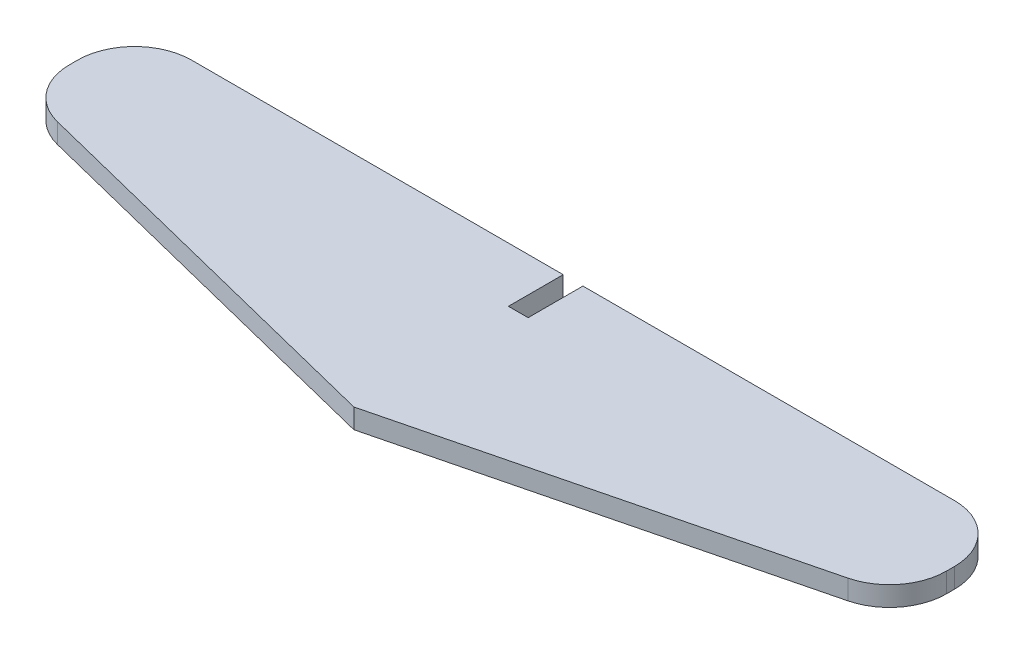
ISO-10303-21;
HEADER;
FILE_DESCRIPTION(('STEP AP214'),'2;1');
FILE_NAME('part.step','',(''),(''),'','','');
FILE_SCHEMA(('AUTOMOTIVE_DESIGN { 1 0 10303 214 1 1 1 1 }'));
ENDSEC;
DATA;
#1=APPLICATION_CONTEXT('core data for automotive mechanical design processes');
#2=APPLICATION_PROTOCOL_DEFINITION('international standard','automotive_design',2000,#1);
#3=PRODUCT_CONTEXT('',#1,'mechanical');
#4=PRODUCT('Part','Part','',(#3));
#5=PRODUCT_RELATED_PRODUCT_CATEGORY('part','',(#4));
#6=PRODUCT_DEFINITION_FORMATION('','',#4);
#7=PRODUCT_DEFINITION_CONTEXT('part definition',#1,'design');
#8=PRODUCT_DEFINITION('design','',#6,#7);
#9=PRODUCT_DEFINITION_SHAPE('','',#8);
#10=(LENGTH_UNIT() NAMED_UNIT(*) SI_UNIT(.MILLI.,.METRE.));
#11=(NAMED_UNIT(*) PLANE_ANGLE_UNIT() SI_UNIT($,.RADIAN.));
#12=(NAMED_UNIT(*) SI_UNIT($,.STERADIAN.) SOLID_ANGLE_UNIT());
#13=UNCERTAINTY_MEASURE_WITH_UNIT(LENGTH_MEASURE(1.E-05),#10,'distance_accuracy_value','');
#14=(GEOMETRIC_REPRESENTATION_CONTEXT(3) GLOBAL_UNCERTAINTY_ASSIGNED_CONTEXT((#13)) GLOBAL_UNIT_ASSIGNED_CONTEXT((#10,
#11,#12)) REPRESENTATION_CONTEXT('',''));
#15=CARTESIAN_POINT('',(0.,0.,0.));
#16=DIRECTION('',(0.,0.,1.));
#17=DIRECTION('',(1.,0.,0.));
#18=AXIS2_PLACEMENT_3D('',#15,#16,#17);
#19=CARTESIAN_POINT('',(7.9698067837182,4.5,-50.));
#20=DIRECTION('',(0.,0.,1.));
#21=DIRECTION('',(1.,0.,0.));
#22=AXIS2_PLACEMENT_3D('',#19,#20,#21);
#23=PLANE('',#22);
#24=DIRECTION('',(-1.,0.,0.));
#25=VECTOR('',#24,1.);
#26=CARTESIAN_POINT('',(7.9698067837182,0.,-50.));
#27=LINE('',#26,#25);
#28=CARTESIAN_POINT('',(7.9698067837182,0.,-50.));
#29=VERTEX_POINT('',#28);
#30=CARTESIAN_POINT('',(-76.7801932162818,0.,-50.));
#31=VERTEX_POINT('',#30);
#32=EDGE_CURVE('E170',#29,#31,#27,.T.);
#33=ORIENTED_EDGE('',*,*,#32,.T.);
#34=DIRECTION('',(0.,-1.,0.));
#35=VECTOR('',#34,1.);
#36=CARTESIAN_POINT('',(-76.7801932162818,4.5,-50.));
#37=LINE('',#36,#35);
#38=CARTESIAN_POINT('',(-76.7801932162818,4.5,-50.));
#39=VERTEX_POINT('',#38);
#40=EDGE_CURVE('E220',#31,#39,#37,.F.);
#41=ORIENTED_EDGE('',*,*,#40,.T.);
#42=DIRECTION('',(-1.,0.,0.));
#43=VECTOR('',#42,1.);
#44=CARTESIAN_POINT('',(7.9698067837182,4.5,-50.));
#45=LINE('',#44,#43);
#46=CARTESIAN_POINT('',(7.9698067837182,4.5,-50.));
#47=VERTEX_POINT('',#46);
#48=EDGE_CURVE('E189',#47,#39,#45,.T.);
#49=ORIENTED_EDGE('',*,*,#48,.F.);
#50=DIRECTION('',(0.,-1.,0.));
#51=VECTOR('',#50,1.);
#52=CARTESIAN_POINT('',(7.9698067837182,4.5,-50.));
#53=LINE('',#52,#51);
#54=EDGE_CURVE('E169',#47,#29,#53,.T.);
#55=ORIENTED_EDGE('',*,*,#54,.T.);
#56=EDGE_LOOP('',(#33,#41,#49,#55));
#57=FACE_BOUND('',#56,.T.);
#58=ADVANCED_FACE('F35',(#57),#23,.F.);
#59=CARTESIAN_POINT('',(-89.7801932162818,4.5,-50.));
#60=DIRECTION('',(1.,0.,0.));
#61=DIRECTION('',(0.,0.,-1.));
#62=AXIS2_PLACEMENT_3D('',#59,#60,#61);
#63=PLANE('',#62);
#64=DIRECTION('',(0.,0.,1.));
#65=VECTOR('',#64,1.);
#66=CARTESIAN_POINT('',(-89.7801932162818,0.,-50.));
#67=LINE('',#66,#65);
#68=CARTESIAN_POINT('',(-89.7801932162818,0.,-37.));
#69=VERTEX_POINT('',#68);
#70=CARTESIAN_POINT('',(-89.7801932162818,0.,-35.1500932832574));
#71=VERTEX_POINT('',#70);
#72=EDGE_CURVE('E173',#69,#71,#67,.T.);
#73=ORIENTED_EDGE('',*,*,#72,.T.);
#74=DIRECTION('',(0.,-1.,0.));
#75=VECTOR('',#74,1.);
#76=CARTESIAN_POINT('',(-89.7801932162818,4.5,-35.1500932832574));
#77=LINE('',#76,#75);
#78=CARTESIAN_POINT('',(-89.7801932162818,4.5,-35.1500932832574));
#79=VERTEX_POINT('',#78);
#80=EDGE_CURVE('E212',#71,#79,#77,.F.);
#81=ORIENTED_EDGE('',*,*,#80,.T.);
#82=DIRECTION('',(0.,0.,1.));
#83=VECTOR('',#82,1.);
#84=CARTESIAN_POINT('',(-89.7801932162818,4.5,-50.));
#85=LINE('',#84,#83);
#86=CARTESIAN_POINT('',(-89.7801932162818,4.5,-37.));
#87=VERTEX_POINT('',#86);
#88=EDGE_CURVE('E141',#87,#79,#85,.T.);
#89=ORIENTED_EDGE('',*,*,#88,.F.);
#90=DIRECTION('',(0.,-1.,0.));
#91=VECTOR('',#90,1.);
#92=CARTESIAN_POINT('',(-89.7801932162818,4.5,-37.));
#93=LINE('',#92,#91);
#94=EDGE_CURVE('E209',#87,#69,#93,.T.);
#95=ORIENTED_EDGE('',*,*,#94,.T.);
#96=EDGE_LOOP('',(#73,#81,#89,#95));
#97=FACE_BOUND('',#96,.T.);
#98=ADVANCED_FACE('F267',(#97),#63,.F.);
#99=CARTESIAN_POINT('',(10.2198067837182,4.5,0.));
#100=DIRECTION('',(0.242535625036333,0.,-0.970142500145332));
#101=DIRECTION('',(-0.970142500145332,0.,-0.242535625036333));
#102=AXIS2_PLACEMENT_3D('',#99,#100,#101);
#103=PLANE('',#102);
#104=DIRECTION('',(0.970142500145332,0.,0.242535625036333));
#105=VECTOR('',#104,1.);
#106=CARTESIAN_POINT('',(10.2198067837182,4.5,0.));
#107=LINE('',#106,#105);
#108=CARTESIAN_POINT('',(-79.9331563417541,4.5,-22.5382407813681));
#109=VERTEX_POINT('',#108);
#110=CARTESIAN_POINT('',(10.2198067837182,4.5,0.));
#111=VERTEX_POINT('',#110);
#112=EDGE_CURVE('E129',#109,#111,#107,.T.);
#113=ORIENTED_EDGE('',*,*,#112,.F.);
#114=DIRECTION('',(0.,-1.,0.));
#115=VECTOR('',#114,1.);
#116=CARTESIAN_POINT('',(-79.9331563417541,4.5,-22.5382407813681));
#117=LINE('',#116,#115);
#118=CARTESIAN_POINT('',(-79.9331563417541,0.,-22.5382407813681));
#119=VERTEX_POINT('',#118);
#120=EDGE_CURVE('E151',#109,#119,#117,.T.);
#121=ORIENTED_EDGE('',*,*,#120,.T.);
#122=DIRECTION('',(0.970142500145332,0.,0.242535625036333));
#123=VECTOR('',#122,1.);
#124=CARTESIAN_POINT('',(10.2198067837182,0.,0.));
#125=LINE('',#124,#123);
#126=CARTESIAN_POINT('',(10.2198067837182,0.,0.));
#127=VERTEX_POINT('',#126);
#128=EDGE_CURVE('E147',#119,#127,#125,.T.);
#129=ORIENTED_EDGE('',*,*,#128,.T.);
#130=DIRECTION('',(0.,-1.,0.));
#131=VECTOR('',#130,1.);
#132=CARTESIAN_POINT('',(10.2198067837182,4.5,0.));
#133=LINE('',#132,#131);
#134=EDGE_CURVE('E144',#111,#127,#133,.T.);
#135=ORIENTED_EDGE('',*,*,#134,.F.);
#136=EDGE_LOOP('',(#113,#121,#129,#135));
#137=FACE_BOUND('',#136,.T.);
#138=ADVANCED_FACE('F145',(#137),#103,.F.);
#139=CARTESIAN_POINT('',(10.2198067837182,4.5,0.));
#140=DIRECTION('',(-0.242535625036333,0.,-0.970142500145332));
#141=DIRECTION('',(-0.970142500145332,0.,0.242535625036333));
#142=AXIS2_PLACEMENT_3D('',#139,#140,#141);
#143=PLANE('',#142);
#144=DIRECTION('',(0.970142500145332,0.,-0.242535625036333));
#145=VECTOR('',#144,1.);
#146=CARTESIAN_POINT('',(10.2198067837182,0.,0.));
#147=LINE('',#146,#145);
#148=CARTESIAN_POINT('',(100.372769909191,0.,-22.5382407813681));
#149=VERTEX_POINT('',#148);
#150=EDGE_CURVE('E177',#127,#149,#147,.T.);
#151=ORIENTED_EDGE('',*,*,#150,.T.);
#152=DIRECTION('',(0.,-1.,0.));
#153=VECTOR('',#152,1.);
#154=CARTESIAN_POINT('',(100.372769909191,4.5,-22.5382407813681));
#155=LINE('',#154,#153);
#156=CARTESIAN_POINT('',(100.372769909191,4.5,-22.5382407813681));
#157=VERTEX_POINT('',#156);
#158=EDGE_CURVE('E11',#149,#157,#155,.F.);
#159=ORIENTED_EDGE('',*,*,#158,.T.);
#160=DIRECTION('',(0.970142500145332,0.,-0.242535625036333));
#161=VECTOR('',#160,1.);
#162=CARTESIAN_POINT('',(10.2198067837182,4.5,0.));
#163=LINE('',#162,#161);
#164=EDGE_CURVE('E134',#111,#157,#163,.T.);
#165=ORIENTED_EDGE('',*,*,#164,.F.);
#166=ORIENTED_EDGE('',*,*,#134,.T.);
#167=EDGE_LOOP('',(#151,#159,#165,#166));
#168=FACE_BOUND('',#167,.T.);
#169=ADVANCED_FACE('F154',(#168),#143,.F.);
#170=CARTESIAN_POINT('',(110.219806783718,4.5,-25.));
#171=DIRECTION('',(-1.,0.,0.));
#172=DIRECTION('',(0.,0.,1.));
#173=AXIS2_PLACEMENT_3D('',#170,#171,#172);
#174=PLANE('',#173);
#175=DIRECTION('',(0.,0.,-1.));
#176=VECTOR('',#175,1.);
#177=CARTESIAN_POINT('',(110.219806783718,0.,-25.));
#178=LINE('',#177,#176);
#179=CARTESIAN_POINT('',(110.219806783718,0.,-35.1500932832574));
#180=VERTEX_POINT('',#179);
#181=CARTESIAN_POINT('',(110.219806783718,0.,-37.));
#182=VERTEX_POINT('',#181);
#183=EDGE_CURVE('E179',#180,#182,#178,.T.);
#184=ORIENTED_EDGE('',*,*,#183,.T.);
#185=DIRECTION('',(0.,-1.,0.));
#186=VECTOR('',#185,1.);
#187=CARTESIAN_POINT('',(110.219806783718,4.5,-37.));
#188=LINE('',#187,#186);
#189=CARTESIAN_POINT('',(110.219806783718,4.5,-37.));
#190=VERTEX_POINT('',#189);
#191=EDGE_CURVE('E43',#182,#190,#188,.F.);
#192=ORIENTED_EDGE('',*,*,#191,.T.);
#193=DIRECTION('',(0.,0.,-1.));
#194=VECTOR('',#193,1.);
#195=CARTESIAN_POINT('',(110.219806783718,4.5,-25.));
#196=LINE('',#195,#194);
#197=CARTESIAN_POINT('',(110.219806783718,4.5,-35.1500932832574));
#198=VERTEX_POINT('',#197);
#199=EDGE_CURVE('E156',#198,#190,#196,.T.);
#200=ORIENTED_EDGE('',*,*,#199,.F.);
#201=DIRECTION('',(0.,-1.,0.));
#202=VECTOR('',#201,1.);
#203=CARTESIAN_POINT('',(110.219806783718,4.5,-35.1500932832574));
#204=LINE('',#203,#202);
#205=EDGE_CURVE('E225',#198,#180,#204,.T.);
#206=ORIENTED_EDGE('',*,*,#205,.T.);
#207=EDGE_LOOP('',(#184,#192,#200,#206));
#208=FACE_BOUND('',#207,.T.);
#209=ADVANCED_FACE('F229',(#208),#174,.F.);
#210=CARTESIAN_POINT('',(110.219806783718,4.5,-50.));
#211=DIRECTION('',(0.,0.,1.));
#212=DIRECTION('',(1.,0.,0.));
#213=AXIS2_PLACEMENT_3D('',#210,#211,#212);
#214=PLANE('',#213);
#215=DIRECTION('',(-1.,0.,0.));
#216=VECTOR('',#215,1.);
#217=CARTESIAN_POINT('',(110.219806783718,4.5,-50.));
#218=LINE('',#217,#216);
#219=CARTESIAN_POINT('',(97.2198067837182,4.5,-50.));
#220=VERTEX_POINT('',#219);
#221=CARTESIAN_POINT('',(12.4698067837182,4.5,-50.));
#222=VERTEX_POINT('',#221);
#223=EDGE_CURVE('E158',#220,#222,#218,.T.);
#224=ORIENTED_EDGE('',*,*,#223,.F.);
#225=DIRECTION('',(0.,-1.,0.));
#226=VECTOR('',#225,1.);
#227=CARTESIAN_POINT('',(97.2198067837182,4.5,-50.));
#228=LINE('',#227,#226);
#229=CARTESIAN_POINT('',(97.2198067837182,0.,-50.));
#230=VERTEX_POINT('',#229);
#231=EDGE_CURVE('E222',#220,#230,#228,.T.);
#232=ORIENTED_EDGE('',*,*,#231,.T.);
#233=DIRECTION('',(-1.,0.,0.));
#234=VECTOR('',#233,1.);
#235=CARTESIAN_POINT('',(110.219806783718,0.,-50.));
#236=LINE('',#235,#234);
#237=CARTESIAN_POINT('',(12.4698067837182,0.,-50.));
#238=VERTEX_POINT('',#237);
#239=EDGE_CURVE('E181',#230,#238,#236,.T.);
#240=ORIENTED_EDGE('',*,*,#239,.T.);
#241=DIRECTION('',(0.,-1.,0.));
#242=VECTOR('',#241,1.);
#243=CARTESIAN_POINT('',(12.4698067837182,4.5,-50.));
#244=LINE('',#243,#242);
#245=EDGE_CURVE('E152',#222,#238,#244,.T.);
#246=ORIENTED_EDGE('',*,*,#245,.F.);
#247=EDGE_LOOP('',(#224,#232,#240,#246));
#248=FACE_BOUND('',#247,.T.);
#249=ADVANCED_FACE('F239',(#248),#214,.F.);
#250=CARTESIAN_POINT('',(12.4698067837182,4.5,-37.5));
#251=DIRECTION('',(1.,0.,0.));
#252=DIRECTION('',(0.,0.,-1.));
#253=AXIS2_PLACEMENT_3D('',#250,#251,#252);
#254=PLANE('',#253);
#255=DIRECTION('',(0.,0.,1.));
#256=VECTOR('',#255,1.);
#257=CARTESIAN_POINT('',(12.4698067837182,0.,-37.5));
#258=LINE('',#257,#256);
#259=CARTESIAN_POINT('',(12.4698067837182,0.,-37.5));
#260=VERTEX_POINT('',#259);
#261=EDGE_CURVE('E183',#238,#260,#258,.T.);
#262=ORIENTED_EDGE('',*,*,#261,.T.);
#263=DIRECTION('',(0.,-1.,0.));
#264=VECTOR('',#263,1.);
#265=CARTESIAN_POINT('',(12.4698067837182,4.5,-37.5));
#266=LINE('',#265,#264);
#267=CARTESIAN_POINT('',(12.4698067837182,4.5,-37.5));
#268=VERTEX_POINT('',#267);
#269=EDGE_CURVE('E195',#268,#260,#266,.T.);
#270=ORIENTED_EDGE('',*,*,#269,.F.);
#271=DIRECTION('',(0.,0.,1.));
#272=VECTOR('',#271,1.);
#273=CARTESIAN_POINT('',(12.4698067837182,4.5,-37.5));
#274=LINE('',#273,#272);
#275=EDGE_CURVE('E163',#222,#268,#274,.T.);
#276=ORIENTED_EDGE('',*,*,#275,.F.);
#277=ORIENTED_EDGE('',*,*,#245,.T.);
#278=EDGE_LOOP('',(#262,#270,#276,#277));
#279=FACE_BOUND('',#278,.T.);
#280=ADVANCED_FACE('F246',(#279),#254,.F.);
#281=CARTESIAN_POINT('',(7.9698067837182,4.5,-37.5));
#282=DIRECTION('',(0.,0.,1.));
#283=DIRECTION('',(1.,0.,0.));
#284=AXIS2_PLACEMENT_3D('',#281,#282,#283);
#285=PLANE('',#284);
#286=DIRECTION('',(-1.,0.,0.));
#287=VECTOR('',#286,1.);
#288=CARTESIAN_POINT('',(7.9698067837182,0.,-37.5));
#289=LINE('',#288,#287);
#290=CARTESIAN_POINT('',(7.9698067837182,0.,-37.5));
#291=VERTEX_POINT('',#290);
#292=EDGE_CURVE('E185',#260,#291,#289,.T.);
#293=ORIENTED_EDGE('',*,*,#292,.T.);
#294=DIRECTION('',(0.,-1.,0.));
#295=VECTOR('',#294,1.);
#296=CARTESIAN_POINT('',(7.9698067837182,4.5,-37.5));
#297=LINE('',#296,#295);
#298=CARTESIAN_POINT('',(7.9698067837182,4.5,-37.5));
#299=VERTEX_POINT('',#298);
#300=EDGE_CURVE('E192',#299,#291,#297,.T.);
#301=ORIENTED_EDGE('',*,*,#300,.F.);
#302=DIRECTION('',(-1.,0.,0.));
#303=VECTOR('',#302,1.);
#304=CARTESIAN_POINT('',(7.9698067837182,4.5,-37.5));
#305=LINE('',#304,#303);
#306=EDGE_CURVE('E165',#268,#299,#305,.T.);
#307=ORIENTED_EDGE('',*,*,#306,.F.);
#308=ORIENTED_EDGE('',*,*,#269,.T.);
#309=EDGE_LOOP('',(#293,#301,#307,#308));
#310=FACE_BOUND('',#309,.T.);
#311=ADVANCED_FACE('F249',(#310),#285,.F.);
#312=CARTESIAN_POINT('',(7.9698067837182,4.5,-50.));
#313=DIRECTION('',(-1.,0.,0.));
#314=DIRECTION('',(0.,0.,1.));
#315=AXIS2_PLACEMENT_3D('',#312,#313,#314);
#316=PLANE('',#315);
#317=DIRECTION('',(0.,0.,-1.));
#318=VECTOR('',#317,1.);
#319=CARTESIAN_POINT('',(7.9698067837182,0.,-50.));
#320=LINE('',#319,#318);
#321=EDGE_CURVE('E187',#291,#29,#320,.T.);
#322=ORIENTED_EDGE('',*,*,#321,.T.);
#323=ORIENTED_EDGE('',*,*,#54,.F.);
#324=DIRECTION('',(0.,0.,-1.));
#325=VECTOR('',#324,1.);
#326=CARTESIAN_POINT('',(7.9698067837182,4.5,-50.));
#327=LINE('',#326,#325);
#328=EDGE_CURVE('E167',#299,#47,#327,.T.);
#329=ORIENTED_EDGE('',*,*,#328,.F.);
#330=ORIENTED_EDGE('',*,*,#300,.T.);
#331=EDGE_LOOP('',(#322,#323,#329,#330));
#332=FACE_BOUND('',#331,.T.);
#333=ADVANCED_FACE('F254',(#332),#316,.F.);
#334=CARTESIAN_POINT('',(0.,4.5,0.));
#335=DIRECTION('',(0.,1.,0.));
#336=DIRECTION('',(0.,0.,1.));
#337=AXIS2_PLACEMENT_3D('',#334,#335,#336);
#338=PLANE('',#337);
#339=ORIENTED_EDGE('',*,*,#88,.T.);
#340=CARTESIAN_POINT('',(-76.7801932162818,4.5,-35.1500932832574));
#341=DIRECTION('',(0.,1.,0.));
#342=DIRECTION('',(0.,0.,1.));
#343=AXIS2_PLACEMENT_3D('',#340,#341,#342);
#344=CIRCLE('',#343,13.);
#345=EDGE_CURVE('E137',#79,#109,#344,.T.);
#346=ORIENTED_EDGE('',*,*,#345,.T.);
#347=ORIENTED_EDGE('',*,*,#112,.T.);
#348=ORIENTED_EDGE('',*,*,#164,.T.);
#349=CARTESIAN_POINT('',(97.2198067837182,4.5,-35.1500932832574));
#350=DIRECTION('',(0.,1.,0.));
#351=DIRECTION('',(0.,0.,1.));
#352=AXIS2_PLACEMENT_3D('',#349,#350,#351);
#353=CIRCLE('',#352,13.);
#354=EDGE_CURVE('E214',#157,#198,#353,.T.);
#355=ORIENTED_EDGE('',*,*,#354,.T.);
#356=ORIENTED_EDGE('',*,*,#199,.T.);
#357=CARTESIAN_POINT('',(97.2198067837182,4.5,-37.));
#358=DIRECTION('',(0.,1.,0.));
#359=DIRECTION('',(0.,0.,1.));
#360=AXIS2_PLACEMENT_3D('',#357,#358,#359);
#361=CIRCLE('',#360,13.);
#362=EDGE_CURVE('E50',#190,#220,#361,.T.);
#363=ORIENTED_EDGE('',*,*,#362,.T.);
#364=ORIENTED_EDGE('',*,*,#223,.T.);
#365=ORIENTED_EDGE('',*,*,#275,.T.);
#366=ORIENTED_EDGE('',*,*,#306,.T.);
#367=ORIENTED_EDGE('',*,*,#328,.T.);
#368=ORIENTED_EDGE('',*,*,#48,.T.);
#369=CARTESIAN_POINT('',(-76.7801932162818,4.5,-37.));
#370=DIRECTION('',(0.,1.,0.));
#371=DIRECTION('',(0.,0.,1.));
#372=AXIS2_PLACEMENT_3D('',#369,#370,#371);
#373=CIRCLE('',#372,13.);
#374=EDGE_CURVE('E217',#39,#87,#373,.T.);
#375=ORIENTED_EDGE('',*,*,#374,.T.);
#376=EDGE_LOOP('',(#339,#346,#347,#348,#355,#356,#363,#364,#365,#366,#367,#368,#375));
#377=FACE_BOUND('',#376,.T.);
#378=ADVANCED_FACE('F132',(#377),#338,.T.);
#379=CARTESIAN_POINT('',(0.,0.,0.));
#380=DIRECTION('',(0.,1.,0.));
#381=DIRECTION('',(0.,0.,1.));
#382=AXIS2_PLACEMENT_3D('',#379,#380,#381);
#383=PLANE('',#382);
#384=ORIENTED_EDGE('',*,*,#128,.F.);
#385=CARTESIAN_POINT('',(-76.7801932162818,0.,-35.1500932832574));
#386=DIRECTION('',(0.,1.,0.));
#387=DIRECTION('',(0.,0.,1.));
#388=AXIS2_PLACEMENT_3D('',#385,#386,#387);
#389=CIRCLE('',#388,13.);
#390=EDGE_CURVE('E207',#119,#71,#389,.F.);
#391=ORIENTED_EDGE('',*,*,#390,.T.);
#392=ORIENTED_EDGE('',*,*,#72,.F.);
#393=CARTESIAN_POINT('',(-76.7801932162818,0.,-37.));
#394=DIRECTION('',(0.,1.,0.));
#395=DIRECTION('',(0.,0.,1.));
#396=AXIS2_PLACEMENT_3D('',#393,#394,#395);
#397=CIRCLE('',#396,13.);
#398=EDGE_CURVE('E205',#69,#31,#397,.F.);
#399=ORIENTED_EDGE('',*,*,#398,.T.);
#400=ORIENTED_EDGE('',*,*,#32,.F.);
#401=ORIENTED_EDGE('',*,*,#321,.F.);
#402=ORIENTED_EDGE('',*,*,#292,.F.);
#403=ORIENTED_EDGE('',*,*,#261,.F.);
#404=ORIENTED_EDGE('',*,*,#239,.F.);
#405=CARTESIAN_POINT('',(97.2198067837182,0.,-37.));
#406=DIRECTION('',(0.,1.,0.));
#407=DIRECTION('',(0.,0.,1.));
#408=AXIS2_PLACEMENT_3D('',#405,#406,#407);
#409=CIRCLE('',#408,13.);
#410=EDGE_CURVE('E203',#230,#182,#409,.F.);
#411=ORIENTED_EDGE('',*,*,#410,.T.);
#412=ORIENTED_EDGE('',*,*,#183,.F.);
#413=CARTESIAN_POINT('',(97.2198067837182,0.,-35.1500932832574));
#414=DIRECTION('',(0.,1.,0.));
#415=DIRECTION('',(0.,0.,1.));
#416=AXIS2_PLACEMENT_3D('',#413,#414,#415);
#417=CIRCLE('',#416,13.);
#418=EDGE_CURVE('E201',#180,#149,#417,.F.);
#419=ORIENTED_EDGE('',*,*,#418,.T.);
#420=ORIENTED_EDGE('',*,*,#150,.F.);
#421=EDGE_LOOP('',(#384,#391,#392,#399,#400,#401,#402,#403,#404,#411,#412,#419,#420));
#422=FACE_BOUND('',#421,.T.);
#423=ADVANCED_FACE('F232',(#422),#383,.F.);
#424=CARTESIAN_POINT('',(-76.7801932162818,4.5,-35.1500932832574));
#425=DIRECTION('',(0.,-1.,0.));
#426=DIRECTION('',(0.,0.,-1.));
#427=AXIS2_PLACEMENT_3D('',#424,#425,#426);
#428=CYLINDRICAL_SURFACE('',#427,13.);
#429=ORIENTED_EDGE('',*,*,#345,.F.);
#430=ORIENTED_EDGE('',*,*,#80,.F.);
#431=ORIENTED_EDGE('',*,*,#390,.F.);
#432=ORIENTED_EDGE('',*,*,#120,.F.);
#433=EDGE_LOOP('',(#429,#430,#431,#432));
#434=FACE_BOUND('',#433,.T.);
#435=ADVANCED_FACE('F271',(#434),#428,.T.);
#436=CARTESIAN_POINT('',(-76.7801932162818,4.5,-37.));
#437=DIRECTION('',(0.,-1.,0.));
#438=DIRECTION('',(0.,0.,-1.));
#439=AXIS2_PLACEMENT_3D('',#436,#437,#438);
#440=CYLINDRICAL_SURFACE('',#439,13.);
#441=ORIENTED_EDGE('',*,*,#374,.F.);
#442=ORIENTED_EDGE('',*,*,#40,.F.);
#443=ORIENTED_EDGE('',*,*,#398,.F.);
#444=ORIENTED_EDGE('',*,*,#94,.F.);
#445=EDGE_LOOP('',(#441,#442,#443,#444));
#446=FACE_BOUND('',#445,.T.);
#447=ADVANCED_FACE('F264',(#446),#440,.T.);
#448=CARTESIAN_POINT('',(97.2198067837182,4.5,-37.));
#449=DIRECTION('',(0.,-1.,0.));
#450=DIRECTION('',(0.,0.,-1.));
#451=AXIS2_PLACEMENT_3D('',#448,#449,#450);
#452=CYLINDRICAL_SURFACE('',#451,13.);
#453=ORIENTED_EDGE('',*,*,#362,.F.);
#454=ORIENTED_EDGE('',*,*,#191,.F.);
#455=ORIENTED_EDGE('',*,*,#410,.F.);
#456=ORIENTED_EDGE('',*,*,#231,.F.);
#457=EDGE_LOOP('',(#453,#454,#455,#456));
#458=FACE_BOUND('',#457,.T.);
#459=ADVANCED_FACE('F237',(#458),#452,.T.);
#460=CARTESIAN_POINT('',(97.2198067837182,4.5,-35.1500932832574));
#461=DIRECTION('',(0.,-1.,0.));
#462=DIRECTION('',(0.,0.,-1.));
#463=AXIS2_PLACEMENT_3D('',#460,#461,#462);
#464=CYLINDRICAL_SURFACE('',#463,13.);
#465=ORIENTED_EDGE('',*,*,#354,.F.);
#466=ORIENTED_EDGE('',*,*,#158,.F.);
#467=ORIENTED_EDGE('',*,*,#418,.F.);
#468=ORIENTED_EDGE('',*,*,#205,.F.);
#469=EDGE_LOOP('',(#465,#466,#467,#468));
#470=FACE_BOUND('',#469,.T.);
#471=ADVANCED_FACE('F37',(#470),#464,.T.);
#472=CLOSED_SHELL('',(#58,#98,#138,#169,#209,#249,#280,#311,#333,#378,#423,#435,#447,#459,#471));
#473=MANIFOLD_SOLID_BREP('B2',#472);
#474=ADVANCED_BREP_SHAPE_REPRESENTATION('',(#18,#473),#14);
#475=SHAPE_DEFINITION_REPRESENTATION(#9,#474);
ENDSEC;
END-ISO-10303-21;
